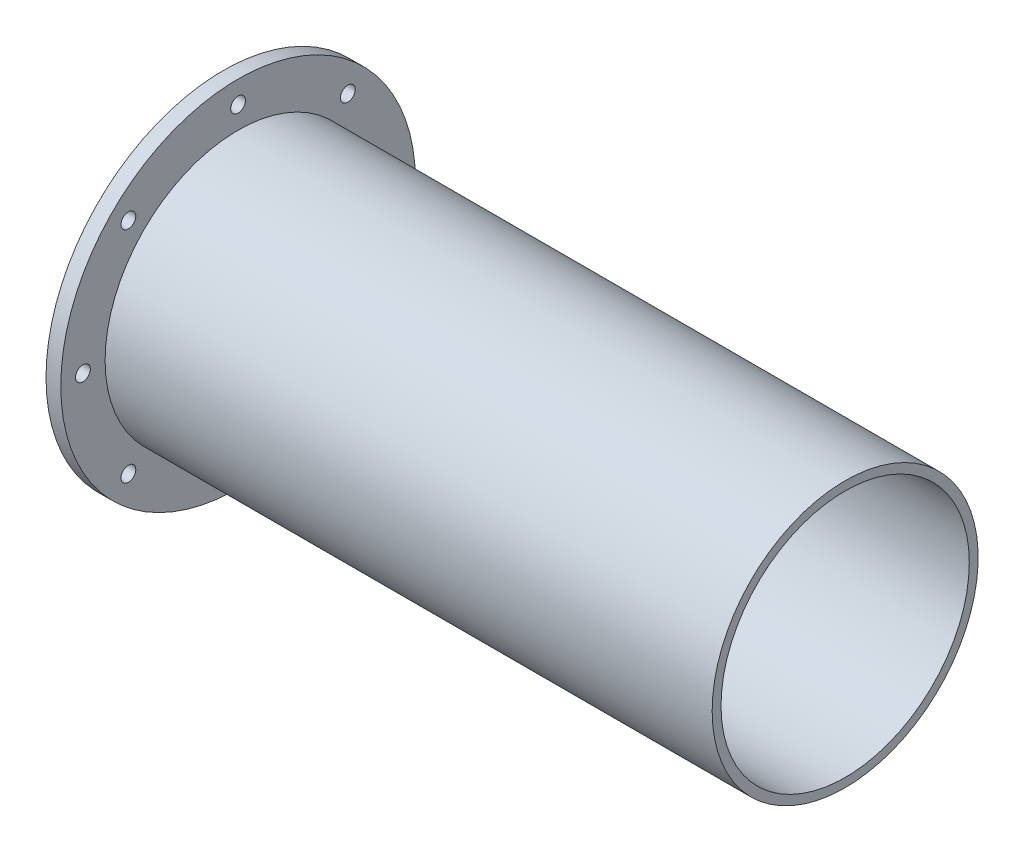
ISO-10303-21;
HEADER;
FILE_DESCRIPTION(('STEP AP214'),'2;1');
FILE_NAME('part.step','',(''),(''),'','','');
FILE_SCHEMA(('AUTOMOTIVE_DESIGN { 1 0 10303 214 1 1 1 1 }'));
ENDSEC;
DATA;
#1=APPLICATION_CONTEXT('core data for automotive mechanical design processes');
#2=APPLICATION_PROTOCOL_DEFINITION('international standard','automotive_design',2000,#1);
#3=PRODUCT_CONTEXT('',#1,'mechanical');
#4=PRODUCT('Part','Part','',(#3));
#5=PRODUCT_RELATED_PRODUCT_CATEGORY('part','',(#4));
#6=PRODUCT_DEFINITION_FORMATION('','',#4);
#7=PRODUCT_DEFINITION_CONTEXT('part definition',#1,'design');
#8=PRODUCT_DEFINITION('design','',#6,#7);
#9=PRODUCT_DEFINITION_SHAPE('','',#8);
#10=(LENGTH_UNIT() NAMED_UNIT(*) SI_UNIT(.MILLI.,.METRE.));
#11=(NAMED_UNIT(*) PLANE_ANGLE_UNIT() SI_UNIT($,.RADIAN.));
#12=(NAMED_UNIT(*) SI_UNIT($,.STERADIAN.) SOLID_ANGLE_UNIT());
#13=UNCERTAINTY_MEASURE_WITH_UNIT(LENGTH_MEASURE(1.E-05),#10,'distance_accuracy_value','');
#14=(GEOMETRIC_REPRESENTATION_CONTEXT(3) GLOBAL_UNCERTAINTY_ASSIGNED_CONTEXT((#13)) GLOBAL_UNIT_ASSIGNED_CONTEXT((#10,
#11,#12)) REPRESENTATION_CONTEXT('',''));
#15=CARTESIAN_POINT('',(0.,0.,0.));
#16=DIRECTION('',(0.,0.,1.));
#17=DIRECTION('',(1.,0.,0.));
#18=AXIS2_PLACEMENT_3D('',#15,#16,#17);
#19=CARTESIAN_POINT('',(0.,76.2,0.));
#20=DIRECTION('',(1.,0.,0.));
#21=DIRECTION('',(0.,0.,-1.));
#22=AXIS2_PLACEMENT_3D('',#19,#20,#21);
#23=PLANE('',#22);
#24=CARTESIAN_POINT('',(0.,66.675,-2.32794518267366E-13));
#25=DIRECTION('',(1.,0.,0.));
#26=DIRECTION('',(0.,-1.,0.));
#27=AXIS2_PLACEMENT_3D('',#24,#25,#26);
#28=CIRCLE('',#27,3.175);
#29=CARTESIAN_POINT('',(0.,63.5,-2.21709065016539E-13));
#30=VERTEX_POINT('',#29);
#31=EDGE_CURVE('E72',#30,#30,#28,.T.);
#32=ORIENTED_EDGE('',*,*,#31,.T.);
#33=EDGE_LOOP('',(#32));
#34=FACE_BOUND('',#33,.T.);
#35=CARTESIAN_POINT('',(0.,47.1463446356128,-47.1463446356133));
#36=DIRECTION('',(1.,0.,0.));
#37=DIRECTION('',(0.,-0.707106781186544,0.707106781186551));
#38=AXIS2_PLACEMENT_3D('',#35,#36,#37);
#39=CIRCLE('',#38,3.175);
#40=CARTESIAN_POINT('',(0.,44.9012806053455,-44.901280605346));
#41=VERTEX_POINT('',#40);
#42=EDGE_CURVE('E91',#41,#41,#39,.T.);
#43=ORIENTED_EDGE('',*,*,#42,.T.);
#44=EDGE_LOOP('',(#43));
#45=FACE_BOUND('',#44,.T.);
#46=CARTESIAN_POINT('',(0.,0.,-66.675));
#47=DIRECTION('',(1.,0.,0.));
#48=DIRECTION('',(0.,0.,1.));
#49=AXIS2_PLACEMENT_3D('',#46,#47,#48);
#50=CIRCLE('',#49,3.175);
#51=CARTESIAN_POINT('',(0.,0.,-63.5));
#52=VERTEX_POINT('',#51);
#53=EDGE_CURVE('E85',#52,#52,#50,.T.);
#54=ORIENTED_EDGE('',*,*,#53,.T.);
#55=EDGE_LOOP('',(#54));
#56=FACE_BOUND('',#55,.T.);
#57=CARTESIAN_POINT('',(0.,-47.1463446356135,-47.1463446356126));
#58=DIRECTION('',(1.,0.,0.));
#59=DIRECTION('',(0.,0.707106781186554,0.707106781186541));
#60=AXIS2_PLACEMENT_3D('',#57,#58,#59);
#61=CIRCLE('',#60,3.175);
#62=CARTESIAN_POINT('',(0.,-44.9012806053462,-44.9012806053454));
#63=VERTEX_POINT('',#62);
#64=EDGE_CURVE('E78',#63,#63,#61,.T.);
#65=ORIENTED_EDGE('',*,*,#64,.T.);
#66=EDGE_LOOP('',(#65));
#67=FACE_BOUND('',#66,.T.);
#68=CARTESIAN_POINT('',(0.,-66.675,6.98383554802098E-13));
#69=DIRECTION('',(1.,0.,0.));
#70=DIRECTION('',(0.,1.,0.));
#71=AXIS2_PLACEMENT_3D('',#68,#69,#70);
#72=CIRCLE('',#71,3.175);
#73=CARTESIAN_POINT('',(0.,-63.5,6.65127195049617E-13));
#74=VERTEX_POINT('',#73);
#75=EDGE_CURVE('E79',#74,#74,#72,.T.);
#76=ORIENTED_EDGE('',*,*,#75,.T.);
#77=EDGE_LOOP('',(#76));
#78=FACE_BOUND('',#77,.T.);
#79=CARTESIAN_POINT('',(0.,-47.1463446356125,47.1463446356136));
#80=DIRECTION('',(1.,0.,0.));
#81=DIRECTION('',(0.,0.707106781186539,-0.707106781186556));
#82=AXIS2_PLACEMENT_3D('',#79,#80,#81);
#83=CIRCLE('',#82,3.175);
#84=CARTESIAN_POINT('',(0.,-44.9012806053452,44.9012806053463));
#85=VERTEX_POINT('',#84);
#86=EDGE_CURVE('E102',#85,#85,#83,.T.);
#87=ORIENTED_EDGE('',*,*,#86,.T.);
#88=EDGE_LOOP('',(#87));
#89=FACE_BOUND('',#88,.T.);
#90=CARTESIAN_POINT('',(0.,47.1463446356131,47.146344635613));
#91=DIRECTION('',(1.,0.,0.));
#92=DIRECTION('',(0.,-0.707106781186549,-0.707106781186546));
#93=AXIS2_PLACEMENT_3D('',#90,#91,#92);
#94=CIRCLE('',#93,3.175);
#95=CARTESIAN_POINT('',(0.,44.9012806053458,44.9012806053457));
#96=VERTEX_POINT('',#95);
#97=EDGE_CURVE('E66',#96,#96,#94,.T.);
#98=ORIENTED_EDGE('',*,*,#97,.T.);
#99=EDGE_LOOP('',(#98));
#100=FACE_BOUND('',#99,.T.);
#101=CARTESIAN_POINT('',(0.,0.,66.675));
#102=DIRECTION('',(1.,0.,0.));
#103=DIRECTION('',(0.,0.,-1.));
#104=AXIS2_PLACEMENT_3D('',#101,#102,#103);
#105=CIRCLE('',#104,3.175);
#106=CARTESIAN_POINT('',(0.,0.,63.5));
#107=VERTEX_POINT('',#106);
#108=EDGE_CURVE('E62',#107,#107,#105,.T.);
#109=ORIENTED_EDGE('',*,*,#108,.T.);
#110=EDGE_LOOP('',(#109));
#111=FACE_BOUND('',#110,.T.);
#112=CARTESIAN_POINT('',(0.,0.,0.));
#113=DIRECTION('',(-1.,0.,0.));
#114=DIRECTION('',(0.,0.,1.));
#115=AXIS2_PLACEMENT_3D('',#112,#113,#114);
#116=CIRCLE('',#115,53.34);
#117=CARTESIAN_POINT('',(0.,0.,53.34));
#118=VERTEX_POINT('',#117);
#119=EDGE_CURVE('E10',#118,#118,#116,.T.);
#120=ORIENTED_EDGE('',*,*,#119,.F.);
#121=EDGE_LOOP('',(#120));
#122=FACE_BOUND('',#121,.T.);
#123=CARTESIAN_POINT('',(0.,0.,0.));
#124=DIRECTION('',(-1.,0.,0.));
#125=DIRECTION('',(0.,0.,1.));
#126=AXIS2_PLACEMENT_3D('',#123,#124,#125);
#127=CIRCLE('',#126,76.2);
#128=CARTESIAN_POINT('',(0.,0.,76.2));
#129=VERTEX_POINT('',#128);
#130=EDGE_CURVE('E59',#129,#129,#127,.T.);
#131=ORIENTED_EDGE('',*,*,#130,.T.);
#132=EDGE_LOOP('',(#131));
#133=FACE_BOUND('',#132,.T.);
#134=ADVANCED_FACE('F37',(#34,#45,#56,#67,#78,#89,#100,#111,#122,#133),#23,.F.);
#135=CARTESIAN_POINT('',(0.,0.,0.));
#136=DIRECTION('',(-1.,0.,0.));
#137=DIRECTION('',(0.,0.,1.));
#138=AXIS2_PLACEMENT_3D('',#135,#136,#137);
#139=CYLINDRICAL_SURFACE('',#138,53.34);
#140=CARTESIAN_POINT('',(267.208,0.,0.));
#141=DIRECTION('',(-1.,0.,0.));
#142=DIRECTION('',(0.,0.,1.));
#143=AXIS2_PLACEMENT_3D('',#140,#141,#142);
#144=CIRCLE('',#143,53.34);
#145=CARTESIAN_POINT('',(267.208,0.,53.34));
#146=VERTEX_POINT('',#145);
#147=EDGE_CURVE('E43',#146,#146,#144,.T.);
#148=ORIENTED_EDGE('',*,*,#147,.F.);
#149=EDGE_LOOP('',(#148));
#150=FACE_BOUND('',#149,.T.);
#151=ORIENTED_EDGE('',*,*,#119,.T.);
#152=EDGE_LOOP('',(#151));
#153=FACE_BOUND('',#152,.T.);
#154=ADVANCED_FACE('F145',(#150,#153),#139,.F.);
#155=CARTESIAN_POINT('',(267.208,53.34,0.));
#156=DIRECTION('',(-1.,0.,0.));
#157=DIRECTION('',(0.,0.,1.));
#158=AXIS2_PLACEMENT_3D('',#155,#156,#157);
#159=PLANE('',#158);
#160=CARTESIAN_POINT('',(267.208,0.,0.));
#161=DIRECTION('',(-1.,0.,0.));
#162=DIRECTION('',(0.,0.,1.));
#163=AXIS2_PLACEMENT_3D('',#160,#161,#162);
#164=CIRCLE('',#163,57.15);
#165=CARTESIAN_POINT('',(267.208,0.,57.15));
#166=VERTEX_POINT('',#165);
#167=EDGE_CURVE('E47',#166,#166,#164,.T.);
#168=ORIENTED_EDGE('',*,*,#167,.F.);
#169=EDGE_LOOP('',(#168));
#170=FACE_BOUND('',#169,.T.);
#171=ORIENTED_EDGE('',*,*,#147,.T.);
#172=EDGE_LOOP('',(#171));
#173=FACE_BOUND('',#172,.T.);
#174=ADVANCED_FACE('F140',(#170,#173),#159,.F.);
#175=CARTESIAN_POINT('',(0.,0.,0.));
#176=DIRECTION('',(-1.,0.,0.));
#177=DIRECTION('',(0.,0.,1.));
#178=AXIS2_PLACEMENT_3D('',#175,#176,#177);
#179=CYLINDRICAL_SURFACE('',#178,57.15);
#180=CARTESIAN_POINT('',(6.34999999999999,0.,0.));
#181=DIRECTION('',(-1.,0.,0.));
#182=DIRECTION('',(0.,0.,1.));
#183=AXIS2_PLACEMENT_3D('',#180,#181,#182);
#184=CIRCLE('',#183,57.15);
#185=CARTESIAN_POINT('',(6.34999999999999,0.,57.15));
#186=VERTEX_POINT('',#185);
#187=EDGE_CURVE('E51',#186,#186,#184,.T.);
#188=ORIENTED_EDGE('',*,*,#187,.F.);
#189=EDGE_LOOP('',(#188));
#190=FACE_BOUND('',#189,.T.);
#191=ORIENTED_EDGE('',*,*,#167,.T.);
#192=EDGE_LOOP('',(#191));
#193=FACE_BOUND('',#192,.T.);
#194=ADVANCED_FACE('F125',(#190,#193),#179,.T.);
#195=CARTESIAN_POINT('',(6.35,57.15,0.));
#196=DIRECTION('',(-1.,0.,0.));
#197=DIRECTION('',(0.,0.,1.));
#198=AXIS2_PLACEMENT_3D('',#195,#196,#197);
#199=PLANE('',#198);
#200=CARTESIAN_POINT('',(6.35,66.675,-2.32794518267366E-13));
#201=DIRECTION('',(1.,0.,0.));
#202=DIRECTION('',(0.,-1.,0.));
#203=AXIS2_PLACEMENT_3D('',#200,#201,#202);
#204=CIRCLE('',#203,3.175);
#205=CARTESIAN_POINT('',(6.35,63.5,-2.21709065016539E-13));
#206=VERTEX_POINT('',#205);
#207=EDGE_CURVE('E94',#206,#206,#204,.T.);
#208=ORIENTED_EDGE('',*,*,#207,.F.);
#209=EDGE_LOOP('',(#208));
#210=FACE_BOUND('',#209,.T.);
#211=CARTESIAN_POINT('',(6.35,47.1463446356128,-47.1463446356133));
#212=DIRECTION('',(1.,0.,0.));
#213=DIRECTION('',(0.,-0.707106781186544,0.707106781186551));
#214=AXIS2_PLACEMENT_3D('',#211,#212,#213);
#215=CIRCLE('',#214,3.175);
#216=CARTESIAN_POINT('',(6.35,44.9012806053455,-44.901280605346));
#217=VERTEX_POINT('',#216);
#218=EDGE_CURVE('E88',#217,#217,#215,.T.);
#219=ORIENTED_EDGE('',*,*,#218,.F.);
#220=EDGE_LOOP('',(#219));
#221=FACE_BOUND('',#220,.T.);
#222=CARTESIAN_POINT('',(6.35,0.,-66.675));
#223=DIRECTION('',(1.,0.,0.));
#224=DIRECTION('',(0.,0.,1.));
#225=AXIS2_PLACEMENT_3D('',#222,#223,#224);
#226=CIRCLE('',#225,3.175);
#227=CARTESIAN_POINT('',(6.35,0.,-63.5));
#228=VERTEX_POINT('',#227);
#229=EDGE_CURVE('E82',#228,#228,#226,.T.);
#230=ORIENTED_EDGE('',*,*,#229,.F.);
#231=EDGE_LOOP('',(#230));
#232=FACE_BOUND('',#231,.T.);
#233=CARTESIAN_POINT('',(6.35,-47.1463446356135,-47.1463446356126));
#234=DIRECTION('',(1.,0.,0.));
#235=DIRECTION('',(0.,0.707106781186554,0.707106781186541));
#236=AXIS2_PLACEMENT_3D('',#233,#234,#235);
#237=CIRCLE('',#236,3.175);
#238=CARTESIAN_POINT('',(6.35,-44.9012806053462,-44.9012806053454));
#239=VERTEX_POINT('',#238);
#240=EDGE_CURVE('E75',#239,#239,#237,.T.);
#241=ORIENTED_EDGE('',*,*,#240,.F.);
#242=EDGE_LOOP('',(#241));
#243=FACE_BOUND('',#242,.T.);
#244=CARTESIAN_POINT('',(6.35,-66.675,6.98383554802098E-13));
#245=DIRECTION('',(1.,0.,0.));
#246=DIRECTION('',(0.,1.,0.));
#247=AXIS2_PLACEMENT_3D('',#244,#245,#246);
#248=CIRCLE('',#247,3.175);
#249=CARTESIAN_POINT('',(6.35,-63.5,6.65127195049617E-13));
#250=VERTEX_POINT('',#249);
#251=EDGE_CURVE('E105',#250,#250,#248,.T.);
#252=ORIENTED_EDGE('',*,*,#251,.F.);
#253=EDGE_LOOP('',(#252));
#254=FACE_BOUND('',#253,.T.);
#255=CARTESIAN_POINT('',(6.35,-47.1463446356125,47.1463446356136));
#256=DIRECTION('',(1.,0.,0.));
#257=DIRECTION('',(0.,0.707106781186539,-0.707106781186556));
#258=AXIS2_PLACEMENT_3D('',#255,#256,#257);
#259=CIRCLE('',#258,3.175);
#260=CARTESIAN_POINT('',(6.35,-44.9012806053452,44.9012806053463));
#261=VERTEX_POINT('',#260);
#262=EDGE_CURVE('E99',#261,#261,#259,.T.);
#263=ORIENTED_EDGE('',*,*,#262,.F.);
#264=EDGE_LOOP('',(#263));
#265=FACE_BOUND('',#264,.T.);
#266=CARTESIAN_POINT('',(6.35,47.1463446356131,47.146344635613));
#267=DIRECTION('',(1.,0.,0.));
#268=DIRECTION('',(0.,-0.707106781186549,-0.707106781186546));
#269=AXIS2_PLACEMENT_3D('',#266,#267,#268);
#270=CIRCLE('',#269,3.175);
#271=CARTESIAN_POINT('',(6.35,44.9012806053458,44.9012806053457));
#272=VERTEX_POINT('',#271);
#273=EDGE_CURVE('E69',#272,#272,#270,.T.);
#274=ORIENTED_EDGE('',*,*,#273,.F.);
#275=EDGE_LOOP('',(#274));
#276=FACE_BOUND('',#275,.T.);
#277=CARTESIAN_POINT('',(6.35,0.,66.675));
#278=DIRECTION('',(1.,0.,0.));
#279=DIRECTION('',(0.,0.,-1.));
#280=AXIS2_PLACEMENT_3D('',#277,#278,#279);
#281=CIRCLE('',#280,3.175);
#282=CARTESIAN_POINT('',(6.35,0.,63.5));
#283=VERTEX_POINT('',#282);
#284=EDGE_CURVE('E63',#283,#283,#281,.T.);
#285=ORIENTED_EDGE('',*,*,#284,.F.);
#286=EDGE_LOOP('',(#285));
#287=FACE_BOUND('',#286,.T.);
#288=CARTESIAN_POINT('',(6.35,0.,0.));
#289=DIRECTION('',(-1.,0.,0.));
#290=DIRECTION('',(0.,0.,1.));
#291=AXIS2_PLACEMENT_3D('',#288,#289,#290);
#292=CIRCLE('',#291,76.2);
#293=CARTESIAN_POINT('',(6.35,0.,76.2));
#294=VERTEX_POINT('',#293);
#295=EDGE_CURVE('E56',#294,#294,#292,.T.);
#296=ORIENTED_EDGE('',*,*,#295,.F.);
#297=EDGE_LOOP('',(#296));
#298=FACE_BOUND('',#297,.T.);
#299=ORIENTED_EDGE('',*,*,#187,.T.);
#300=EDGE_LOOP('',(#299));
#301=FACE_BOUND('',#300,.T.);
#302=ADVANCED_FACE('F121',(#210,#221,#232,#243,#254,#265,#276,#287,#298,#301),#199,.F.);
#303=CARTESIAN_POINT('',(0.,0.,0.));
#304=DIRECTION('',(-1.,0.,0.));
#305=DIRECTION('',(0.,0.,1.));
#306=AXIS2_PLACEMENT_3D('',#303,#304,#305);
#307=CYLINDRICAL_SURFACE('',#306,76.2);
#308=ORIENTED_EDGE('',*,*,#130,.F.);
#309=EDGE_LOOP('',(#308));
#310=FACE_BOUND('',#309,.T.);
#311=ORIENTED_EDGE('',*,*,#295,.T.);
#312=EDGE_LOOP('',(#311));
#313=FACE_BOUND('',#312,.T.);
#314=ADVANCED_FACE('F124',(#310,#313),#307,.T.);
#315=CARTESIAN_POINT('',(0.,0.,66.675));
#316=DIRECTION('',(1.,0.,0.));
#317=DIRECTION('',(0.,0.,-1.));
#318=AXIS2_PLACEMENT_3D('',#315,#316,#317);
#319=CYLINDRICAL_SURFACE('',#318,3.175);
#320=ORIENTED_EDGE('',*,*,#108,.F.);
#321=EDGE_LOOP('',(#320));
#322=FACE_BOUND('',#321,.T.);
#323=ORIENTED_EDGE('',*,*,#284,.T.);
#324=EDGE_LOOP('',(#323));
#325=FACE_BOUND('',#324,.T.);
#326=ADVANCED_FACE('F181',(#322,#325),#319,.F.);
#327=CARTESIAN_POINT('',(0.,47.1463446356131,47.146344635613));
#328=DIRECTION('',(1.,0.,0.));
#329=DIRECTION('',(0.,0.,-1.));
#330=AXIS2_PLACEMENT_3D('',#327,#328,#329);
#331=CYLINDRICAL_SURFACE('',#330,3.175);
#332=ORIENTED_EDGE('',*,*,#97,.F.);
#333=EDGE_LOOP('',(#332));
#334=FACE_BOUND('',#333,.T.);
#335=ORIENTED_EDGE('',*,*,#273,.T.);
#336=EDGE_LOOP('',(#335));
#337=FACE_BOUND('',#336,.T.);
#338=ADVANCED_FACE('F178',(#334,#337),#331,.F.);
#339=CARTESIAN_POINT('',(0.,-47.1463446356125,47.1463446356136));
#340=DIRECTION('',(1.,0.,0.));
#341=DIRECTION('',(0.,0.,-1.));
#342=AXIS2_PLACEMENT_3D('',#339,#340,#341);
#343=CYLINDRICAL_SURFACE('',#342,3.175);
#344=ORIENTED_EDGE('',*,*,#86,.F.);
#345=EDGE_LOOP('',(#344));
#346=FACE_BOUND('',#345,.T.);
#347=ORIENTED_EDGE('',*,*,#262,.T.);
#348=EDGE_LOOP('',(#347));
#349=FACE_BOUND('',#348,.T.);
#350=ADVANCED_FACE('F117',(#346,#349),#343,.F.);
#351=CARTESIAN_POINT('',(0.,-66.675,6.98383554802098E-13));
#352=DIRECTION('',(1.,0.,0.));
#353=DIRECTION('',(0.,0.,-1.));
#354=AXIS2_PLACEMENT_3D('',#351,#352,#353);
#355=CYLINDRICAL_SURFACE('',#354,3.175);
#356=ORIENTED_EDGE('',*,*,#75,.F.);
#357=EDGE_LOOP('',(#356));
#358=FACE_BOUND('',#357,.T.);
#359=ORIENTED_EDGE('',*,*,#251,.T.);
#360=EDGE_LOOP('',(#359));
#361=FACE_BOUND('',#360,.T.);
#362=ADVANCED_FACE('F113',(#358,#361),#355,.F.);
#363=CARTESIAN_POINT('',(0.,-47.1463446356135,-47.1463446356126));
#364=DIRECTION('',(1.,0.,0.));
#365=DIRECTION('',(0.,0.,-1.));
#366=AXIS2_PLACEMENT_3D('',#363,#364,#365);
#367=CYLINDRICAL_SURFACE('',#366,3.175);
#368=ORIENTED_EDGE('',*,*,#64,.F.);
#369=EDGE_LOOP('',(#368));
#370=FACE_BOUND('',#369,.T.);
#371=ORIENTED_EDGE('',*,*,#240,.T.);
#372=EDGE_LOOP('',(#371));
#373=FACE_BOUND('',#372,.T.);
#374=ADVANCED_FACE('F116',(#370,#373),#367,.F.);
#375=CARTESIAN_POINT('',(0.,0.,-66.675));
#376=DIRECTION('',(1.,0.,0.));
#377=DIRECTION('',(0.,0.,-1.));
#378=AXIS2_PLACEMENT_3D('',#375,#376,#377);
#379=CYLINDRICAL_SURFACE('',#378,3.175);
#380=ORIENTED_EDGE('',*,*,#53,.F.);
#381=EDGE_LOOP('',(#380));
#382=FACE_BOUND('',#381,.T.);
#383=ORIENTED_EDGE('',*,*,#229,.T.);
#384=EDGE_LOOP('',(#383));
#385=FACE_BOUND('',#384,.T.);
#386=ADVANCED_FACE('F166',(#382,#385),#379,.F.);
#387=CARTESIAN_POINT('',(0.,47.1463446356128,-47.1463446356133));
#388=DIRECTION('',(1.,0.,0.));
#389=DIRECTION('',(0.,0.,-1.));
#390=AXIS2_PLACEMENT_3D('',#387,#388,#389);
#391=CYLINDRICAL_SURFACE('',#390,3.175);
#392=ORIENTED_EDGE('',*,*,#42,.F.);
#393=EDGE_LOOP('',(#392));
#394=FACE_BOUND('',#393,.T.);
#395=ORIENTED_EDGE('',*,*,#218,.T.);
#396=EDGE_LOOP('',(#395));
#397=FACE_BOUND('',#396,.T.);
#398=ADVANCED_FACE('F173',(#394,#397),#391,.F.);
#399=CARTESIAN_POINT('',(0.,66.675,-2.32794518267366E-13));
#400=DIRECTION('',(1.,0.,0.));
#401=DIRECTION('',(0.,0.,-1.));
#402=AXIS2_PLACEMENT_3D('',#399,#400,#401);
#403=CYLINDRICAL_SURFACE('',#402,3.175);
#404=ORIENTED_EDGE('',*,*,#31,.F.);
#405=EDGE_LOOP('',(#404));
#406=FACE_BOUND('',#405,.T.);
#407=ORIENTED_EDGE('',*,*,#207,.T.);
#408=EDGE_LOOP('',(#407));
#409=FACE_BOUND('',#408,.T.);
#410=ADVANCED_FACE('F234',(#406,#409),#403,.F.);
#411=CLOSED_SHELL('',(#134,#154,#174,#194,#302,#314,#326,#338,#350,#362,#374,#386,#398,#410));
#412=MANIFOLD_SOLID_BREP('B2',#411);
#413=ADVANCED_BREP_SHAPE_REPRESENTATION('',(#18,#412),#14);
#414=SHAPE_DEFINITION_REPRESENTATION(#9,#413);
ENDSEC;
END-ISO-10303-21;
